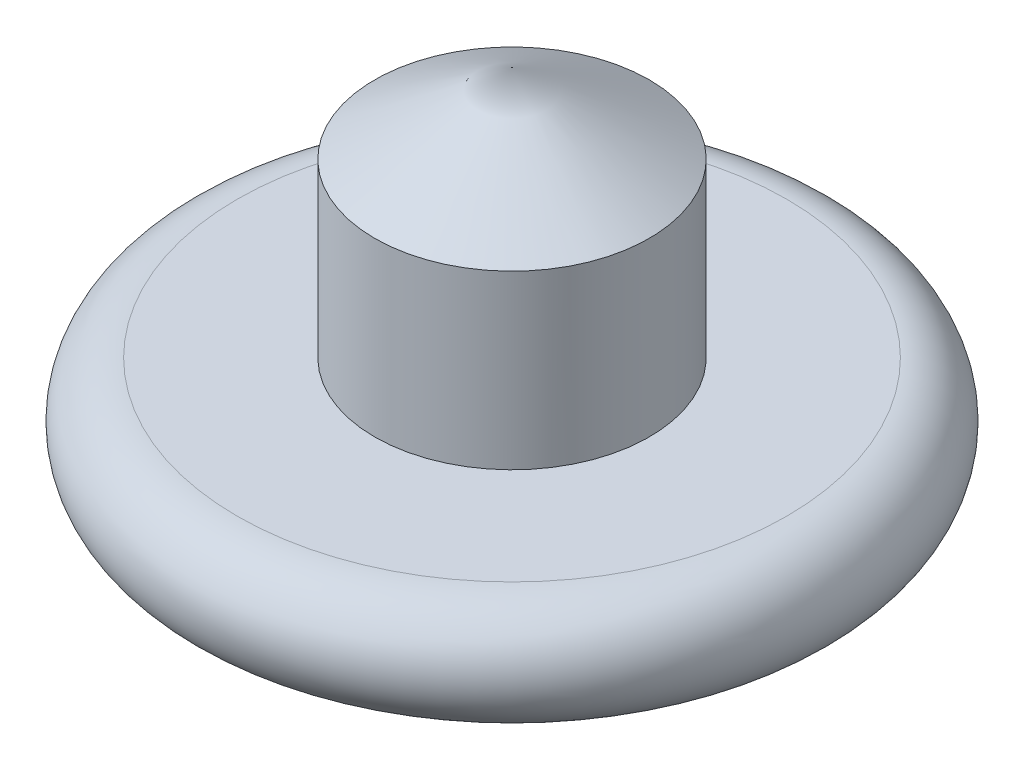
ISO-10303-21;
HEADER;
FILE_DESCRIPTION(('STEP AP214'),'2;1');
FILE_NAME('part.step','',(''),(''),'','','');
FILE_SCHEMA(('AUTOMOTIVE_DESIGN { 1 0 10303 214 1 1 1 1 }'));
ENDSEC;
DATA;
#1=APPLICATION_CONTEXT('core data for automotive mechanical design processes');
#2=APPLICATION_PROTOCOL_DEFINITION('international standard','automotive_design',2000,#1);
#3=PRODUCT_CONTEXT('',#1,'mechanical');
#4=PRODUCT('Part','Part','',(#3));
#5=PRODUCT_RELATED_PRODUCT_CATEGORY('part','',(#4));
#6=PRODUCT_DEFINITION_FORMATION('','',#4);
#7=PRODUCT_DEFINITION_CONTEXT('part definition',#1,'design');
#8=PRODUCT_DEFINITION('design','',#6,#7);
#9=PRODUCT_DEFINITION_SHAPE('','',#8);
#10=(LENGTH_UNIT() NAMED_UNIT(*) SI_UNIT(.MILLI.,.METRE.));
#11=(NAMED_UNIT(*) PLANE_ANGLE_UNIT() SI_UNIT($,.RADIAN.));
#12=(NAMED_UNIT(*) SI_UNIT($,.STERADIAN.) SOLID_ANGLE_UNIT());
#13=UNCERTAINTY_MEASURE_WITH_UNIT(LENGTH_MEASURE(1.E-05),#10,'distance_accuracy_value','');
#14=(GEOMETRIC_REPRESENTATION_CONTEXT(3) GLOBAL_UNCERTAINTY_ASSIGNED_CONTEXT((#13)) GLOBAL_UNIT_ASSIGNED_CONTEXT((#10,
#11,#12)) REPRESENTATION_CONTEXT('',''));
#15=CARTESIAN_POINT('',(0.,0.,0.));
#16=DIRECTION('',(0.,0.,1.));
#17=DIRECTION('',(1.,0.,0.));
#18=AXIS2_PLACEMENT_3D('',#15,#16,#17);
#19=CARTESIAN_POINT('',(0.,0.,0.));
#20=DIRECTION('',(0.,1.,0.));
#21=DIRECTION('',(0.,0.,1.));
#22=AXIS2_PLACEMENT_3D('',#19,#20,#21);
#23=PLANE('',#22);
#24=CARTESIAN_POINT('',(0.,0.,0.));
#25=DIRECTION('',(0.,1.,0.));
#26=DIRECTION('',(0.,0.,1.));
#27=AXIS2_PLACEMENT_3D('',#24,#25,#26);
#28=CIRCLE('',#27,100.);
#29=CARTESIAN_POINT('',(0.,0.,100.));
#30=VERTEX_POINT('',#29);
#31=EDGE_CURVE('E11',#30,#30,#28,.T.);
#32=ORIENTED_EDGE('',*,*,#31,.F.);
#33=EDGE_LOOP('',(#32));
#34=FACE_BOUND('',#33,.T.);
#35=ADVANCED_FACE('F39',(#34),#23,.F.);
#36=CARTESIAN_POINT('',(0.,20.,0.));
#37=DIRECTION('',(0.,1.,0.));
#38=DIRECTION('',(0.,0.,1.));
#39=AXIS2_PLACEMENT_3D('',#36,#37,#38);
#40=TOROIDAL_SURFACE('',#39,100.,20.);
#41=CARTESIAN_POINT('',(0.,40.,0.));
#42=DIRECTION('',(0.,1.,0.));
#43=DIRECTION('',(0.,0.,1.));
#44=AXIS2_PLACEMENT_3D('',#41,#42,#43);
#45=CIRCLE('',#44,100.);
#46=CARTESIAN_POINT('',(0.,40.,100.));
#47=VERTEX_POINT('',#46);
#48=EDGE_CURVE('E46',#47,#47,#45,.T.);
#49=ORIENTED_EDGE('',*,*,#48,.F.);
#50=EDGE_LOOP('',(#49));
#51=FACE_BOUND('',#50,.T.);
#52=ORIENTED_EDGE('',*,*,#31,.T.);
#53=EDGE_LOOP('',(#52));
#54=FACE_BOUND('',#53,.T.);
#55=ADVANCED_FACE('F70',(#51,#54),#40,.T.);
#56=CARTESIAN_POINT('',(100.,40.,0.));
#57=DIRECTION('',(0.,-1.,0.));
#58=DIRECTION('',(0.,0.,-1.));
#59=AXIS2_PLACEMENT_3D('',#56,#57,#58);
#60=PLANE('',#59);
#61=CARTESIAN_POINT('',(0.,40.,0.));
#62=DIRECTION('',(0.,1.,0.));
#63=DIRECTION('',(0.,0.,1.));
#64=AXIS2_PLACEMENT_3D('',#61,#62,#63);
#65=CIRCLE('',#64,50.);
#66=CARTESIAN_POINT('',(0.,40.,50.));
#67=VERTEX_POINT('',#66);
#68=EDGE_CURVE('E59',#67,#67,#65,.T.);
#69=ORIENTED_EDGE('',*,*,#68,.F.);
#70=EDGE_LOOP('',(#69));
#71=FACE_BOUND('',#70,.T.);
#72=ORIENTED_EDGE('',*,*,#48,.T.);
#73=EDGE_LOOP('',(#72));
#74=FACE_BOUND('',#73,.T.);
#75=ADVANCED_FACE('F68',(#71,#74),#60,.F.);
#76=CARTESIAN_POINT('',(0.,131.494609775698,0.));
#77=DIRECTION('',(0.,1.,0.));
#78=DIRECTION('',(0.,0.,1.));
#79=AXIS2_PLACEMENT_3D('',#76,#77,#78);
#80=CYLINDRICAL_SURFACE('',#79,50.);
#81=CARTESIAN_POINT('',(0.,102.627096316217,0.));
#82=DIRECTION('',(0.,1.,0.));
#83=DIRECTION('',(0.,0.,1.));
#84=AXIS2_PLACEMENT_3D('',#81,#82,#83);
#85=CIRCLE('',#84,50.);
#86=CARTESIAN_POINT('',(0.,102.627096316217,50.));
#87=VERTEX_POINT('',#86);
#88=EDGE_CURVE('E56',#87,#87,#85,.T.);
#89=ORIENTED_EDGE('',*,*,#88,.F.);
#90=EDGE_LOOP('',(#89));
#91=FACE_BOUND('',#90,.T.);
#92=ORIENTED_EDGE('',*,*,#68,.T.);
#93=EDGE_LOOP('',(#92));
#94=FACE_BOUND('',#93,.T.);
#95=ADVANCED_FACE('F52',(#91,#94),#80,.T.);
#96=CARTESIAN_POINT('',(0.,102.627096316217,0.));
#97=DIRECTION('',(0.,-1.,0.));
#98=DIRECTION('',(0.,0.,-1.));
#99=AXIS2_PLACEMENT_3D('',#96,#97,#98);
#100=CONICAL_SURFACE('',#99,50.,1.04719755119659);
#101=CARTESIAN_POINT('',(0.,131.494609775698,0.));
#102=VERTEX_POINT('',#101);
#103=VERTEX_LOOP('',#102);
#104=FACE_BOUND('',#103,.T.);
#105=ORIENTED_EDGE('',*,*,#88,.T.);
#106=EDGE_LOOP('',(#105));
#107=FACE_BOUND('',#106,.T.);
#108=ADVANCED_FACE('F49',(#104,#107),#100,.T.);
#109=CLOSED_SHELL('',(#35,#55,#75,#95,#108));
#110=MANIFOLD_SOLID_BREP('B2',#109);
#111=ADVANCED_BREP_SHAPE_REPRESENTATION('',(#18,#110),#14);
#112=SHAPE_DEFINITION_REPRESENTATION(#9,#111);
ENDSEC;
END-ISO-10303-21;
